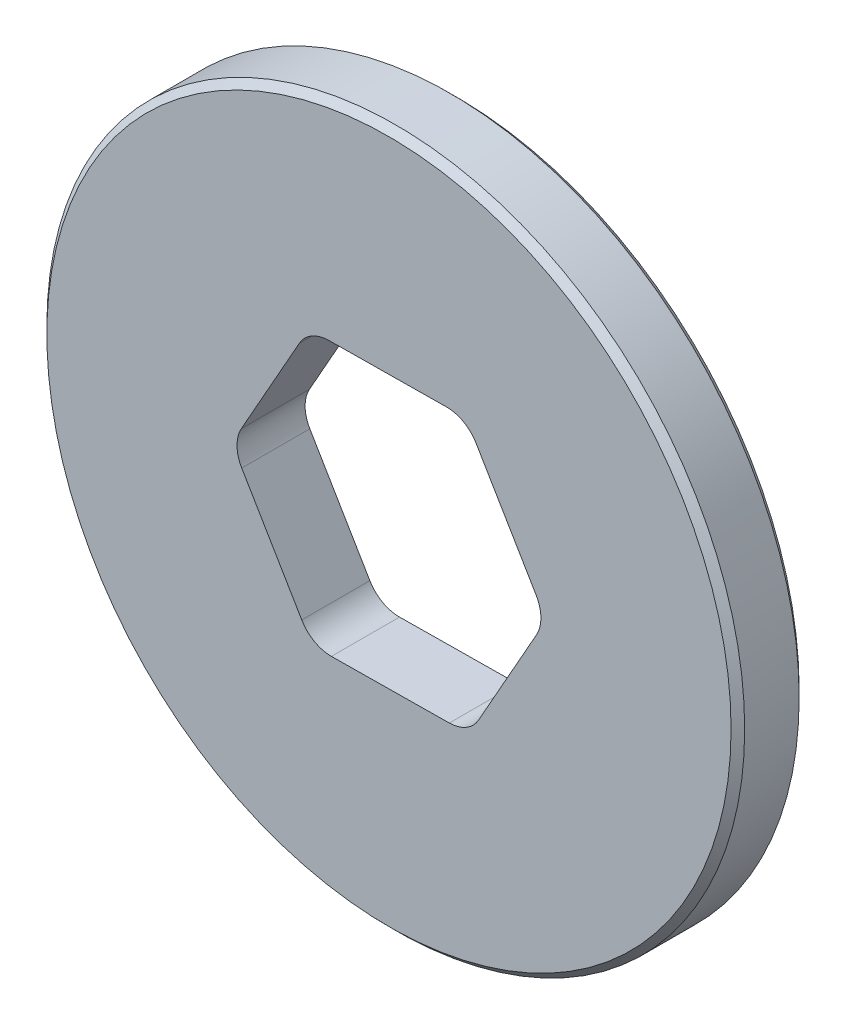
ISO-10303-21;
HEADER;
FILE_DESCRIPTION(('STEP AP214'),'2;1');
FILE_NAME('part.step','',(''),(''),'','','');
FILE_SCHEMA(('AUTOMOTIVE_DESIGN { 1 0 10303 214 1 1 1 1 }'));
ENDSEC;
DATA;
#1=APPLICATION_CONTEXT('core data for automotive mechanical design processes');
#2=APPLICATION_PROTOCOL_DEFINITION('international standard','automotive_design',2000,#1);
#3=PRODUCT_CONTEXT('',#1,'mechanical');
#4=PRODUCT('Part','Part','',(#3));
#5=PRODUCT_RELATED_PRODUCT_CATEGORY('part','',(#4));
#6=PRODUCT_DEFINITION_FORMATION('','',#4);
#7=PRODUCT_DEFINITION_CONTEXT('part definition',#1,'design');
#8=PRODUCT_DEFINITION('design','',#6,#7);
#9=PRODUCT_DEFINITION_SHAPE('','',#8);
#10=(LENGTH_UNIT() NAMED_UNIT(*) SI_UNIT(.MILLI.,.METRE.));
#11=(NAMED_UNIT(*) PLANE_ANGLE_UNIT() SI_UNIT($,.RADIAN.));
#12=(NAMED_UNIT(*) SI_UNIT($,.STERADIAN.) SOLID_ANGLE_UNIT());
#13=UNCERTAINTY_MEASURE_WITH_UNIT(LENGTH_MEASURE(1.E-05),#10,'distance_accuracy_value','');
#14=(GEOMETRIC_REPRESENTATION_CONTEXT(3) GLOBAL_UNCERTAINTY_ASSIGNED_CONTEXT((#13)) GLOBAL_UNIT_ASSIGNED_CONTEXT((#10,
#11,#12)) REPRESENTATION_CONTEXT('',''));
#15=CARTESIAN_POINT('',(0.,0.,0.));
#16=DIRECTION('',(0.,0.,1.));
#17=DIRECTION('',(1.,0.,0.));
#18=AXIS2_PLACEMENT_3D('',#15,#16,#17);
#19=CARTESIAN_POINT('',(0.,0.,20.));
#20=DIRECTION('',(0.,0.,1.));
#21=DIRECTION('',(1.,0.,0.));
#22=AXIS2_PLACEMENT_3D('',#19,#20,#21);
#23=PLANE('',#22);
#24=CARTESIAN_POINT('',(0.,0.,20.));
#25=DIRECTION('',(0.,0.,1.));
#26=DIRECTION('',(1.,0.,0.));
#27=AXIS2_PLACEMENT_3D('',#24,#25,#26);
#28=CIRCLE('',#27,100.5);
#29=CARTESIAN_POINT('',(100.5,0.,20.));
#30=VERTEX_POINT('',#29);
#31=EDGE_CURVE('E11',#30,#30,#28,.T.);
#32=ORIENTED_EDGE('',*,*,#31,.T.);
#33=EDGE_LOOP('',(#32));
#34=FACE_BOUND('',#33,.T.);
#35=DIRECTION('',(0.490930276854335,0.871198865511042,0.));
#36=VECTOR('',#35,1.);
#37=CARTESIAN_POINT('',(23.5104055206342,-39.7566870549933,20.));
#38=LINE('',#37,#36);
#39=CARTESIAN_POINT('',(26.344792795586,-34.7268180597883,20.));
#40=VERTEX_POINT('',#39);
#41=CARTESIAN_POINT('',(43.3511164452973,-4.54760408855848,20.));
#42=VERTEX_POINT('',#41);
#43=EDGE_CURVE('E242',#40,#42,#38,.T.);
#44=ORIENTED_EDGE('',*,*,#43,.F.);
#45=CARTESIAN_POINT('',(17.6328041404756,-29.817515291245,20.));
#46=DIRECTION('',(0.,0.,1.));
#47=DIRECTION('',(1.,0.,0.));
#48=AXIS2_PLACEMENT_3D('',#45,#46,#47);
#49=CIRCLE('',#48,10.);
#50=CARTESIAN_POINT('',(17.737217555603,-39.8169701683241,20.));
#51=VERTEX_POINT('',#50);
#52=EDGE_CURVE('E148',#40,#51,#49,.F.);
#53=ORIENTED_EDGE('',*,*,#52,.T.);
#54=DIRECTION('',(0.999945487707912,0.0104413415127392,0.));
#55=VECTOR('',#54,1.);
#56=CARTESIAN_POINT('',(-22.675098199615,-40.2389519616397,20.));
#57=LINE('',#56,#55);
#58=CARTESIAN_POINT('',(-16.9019102345839,-40.1786688483089,20.));
#59=VERTEX_POINT('',#58);
#60=EDGE_CURVE('E249',#59,#51,#57,.T.);
#61=ORIENTED_EDGE('',*,*,#60,.F.);
#62=CARTESIAN_POINT('',(-17.0063236497113,-30.1792139712298,20.));
#63=DIRECTION('',(0.,0.,1.));
#64=DIRECTION('',(1.,0.,0.));
#65=AXIS2_PLACEMENT_3D('',#62,#63,#64);
#66=CIRCLE('',#65,10.);
#67=CARTESIAN_POINT('',(-25.6138988896943,-35.2693660797656,20.));
#68=VERTEX_POINT('',#67);
#69=EDGE_CURVE('E147',#59,#68,#66,.F.);
#70=ORIENTED_EDGE('',*,*,#69,.T.);
#71=DIRECTION('',(0.509015210853577,-0.860757523998303,0.));
#72=VECTOR('',#71,1.);
#73=CARTESIAN_POINT('',(-46.1855037202492,-0.482264906646469,20.));
#74=LINE('',#73,#72);
#75=CARTESIAN_POINT('',(-43.2467030301699,-5.45185078852063,20.));
#76=VERTEX_POINT('',#75);
#77=EDGE_CURVE('E162',#76,#68,#74,.T.);
#78=ORIENTED_EDGE('',*,*,#77,.F.);
#79=CARTESIAN_POINT('',(-34.6391277901869,-0.361698679984854,20.));
#80=DIRECTION('',(0.,0.,1.));
#81=DIRECTION('',(1.,0.,0.));
#82=AXIS2_PLACEMENT_3D('',#79,#80,#81);
#83=CIRCLE('',#82,10.);
#84=CARTESIAN_POINT('',(-43.3511164452973,4.5476040885585,20.));
#85=VERTEX_POINT('',#84);
#86=EDGE_CURVE('E61',#76,#85,#83,.F.);
#87=ORIENTED_EDGE('',*,*,#86,.T.);
#88=DIRECTION('',(-0.490930276854335,-0.871198865511042,0.));
#89=VECTOR('',#88,1.);
#90=CARTESIAN_POINT('',(-23.5104055206342,39.7566870549933,20.));
#91=LINE('',#90,#89);
#92=CARTESIAN_POINT('',(-26.344792795586,34.7268180597883,20.));
#93=VERTEX_POINT('',#92);
#94=EDGE_CURVE('E167',#93,#85,#91,.T.);
#95=ORIENTED_EDGE('',*,*,#94,.F.);
#96=CARTESIAN_POINT('',(-17.6328041404756,29.817515291245,20.));
#97=DIRECTION('',(0.,0.,1.));
#98=DIRECTION('',(1.,0.,0.));
#99=AXIS2_PLACEMENT_3D('',#96,#97,#98);
#100=CIRCLE('',#99,10.);
#101=CARTESIAN_POINT('',(-17.737217555603,39.8169701683241,20.));
#102=VERTEX_POINT('',#101);
#103=EDGE_CURVE('E208',#93,#102,#100,.F.);
#104=ORIENTED_EDGE('',*,*,#103,.T.);
#105=DIRECTION('',(-0.999945487707912,-0.010441341512739,0.));
#106=VECTOR('',#105,1.);
#107=CARTESIAN_POINT('',(22.675098199615,40.2389519616397,20.));
#108=LINE('',#107,#106);
#109=CARTESIAN_POINT('',(16.9019102345839,40.1786688483089,20.));
#110=VERTEX_POINT('',#109);
#111=EDGE_CURVE('E270',#110,#102,#108,.T.);
#112=ORIENTED_EDGE('',*,*,#111,.F.);
#113=CARTESIAN_POINT('',(17.0063236497113,30.1792139712298,20.));
#114=DIRECTION('',(0.,0.,1.));
#115=DIRECTION('',(1.,0.,0.));
#116=AXIS2_PLACEMENT_3D('',#113,#114,#115);
#117=CIRCLE('',#116,10.);
#118=CARTESIAN_POINT('',(25.6138988896943,35.2693660797656,20.));
#119=VERTEX_POINT('',#118);
#120=EDGE_CURVE('E204',#110,#119,#117,.F.);
#121=ORIENTED_EDGE('',*,*,#120,.T.);
#122=DIRECTION('',(-0.509015210853577,0.860757523998303,0.));
#123=VECTOR('',#122,1.);
#124=CARTESIAN_POINT('',(46.1855037202492,0.482264906646483,20.));
#125=LINE('',#124,#123);
#126=CARTESIAN_POINT('',(43.2467030301699,5.45185078852064,20.));
#127=VERTEX_POINT('',#126);
#128=EDGE_CURVE('E248',#127,#119,#125,.T.);
#129=ORIENTED_EDGE('',*,*,#128,.F.);
#130=CARTESIAN_POINT('',(34.6391277901869,0.361698679984868,20.));
#131=DIRECTION('',(0.,0.,1.));
#132=DIRECTION('',(1.,0.,0.));
#133=AXIS2_PLACEMENT_3D('',#130,#131,#132);
#134=CIRCLE('',#133,10.);
#135=EDGE_CURVE('E200',#127,#42,#134,.F.);
#136=ORIENTED_EDGE('',*,*,#135,.T.);
#137=EDGE_LOOP('',(#44,#53,#61,#70,#78,#87,#95,#104,#112,#121,#129,#136));
#138=FACE_BOUND('',#137,.T.);
#139=ADVANCED_FACE('F45',(#34,#138),#23,.T.);
#140=CARTESIAN_POINT('',(0.,0.,0.));
#141=DIRECTION('',(0.,0.,1.));
#142=DIRECTION('',(1.,0.,0.));
#143=AXIS2_PLACEMENT_3D('',#140,#141,#142);
#144=PLANE('',#143);
#145=CARTESIAN_POINT('',(0.,0.,0.));
#146=DIRECTION('',(0.,0.,1.));
#147=DIRECTION('',(1.,0.,0.));
#148=AXIS2_PLACEMENT_3D('',#145,#146,#147);
#149=CIRCLE('',#148,100.5);
#150=CARTESIAN_POINT('',(100.5,0.,0.));
#151=VERTEX_POINT('',#150);
#152=EDGE_CURVE('E54',#151,#151,#149,.F.);
#153=ORIENTED_EDGE('',*,*,#152,.T.);
#154=EDGE_LOOP('',(#153));
#155=FACE_BOUND('',#154,.T.);
#156=DIRECTION('',(0.509015210853577,-0.860757523998303,0.));
#157=VECTOR('',#156,1.);
#158=CARTESIAN_POINT('',(-46.1855037202492,-0.482264906646469,0.));
#159=LINE('',#158,#157);
#160=CARTESIAN_POINT('',(-43.2467030301699,-5.45185078852063,0.));
#161=VERTEX_POINT('',#160);
#162=CARTESIAN_POINT('',(-25.6138988896943,-35.2693660797656,0.));
#163=VERTEX_POINT('',#162);
#164=EDGE_CURVE('E142',#161,#163,#159,.T.);
#165=ORIENTED_EDGE('',*,*,#164,.T.);
#166=CARTESIAN_POINT('',(-17.0063236497113,-30.1792139712298,0.));
#167=DIRECTION('',(0.,0.,1.));
#168=DIRECTION('',(1.,0.,0.));
#169=AXIS2_PLACEMENT_3D('',#166,#167,#168);
#170=CIRCLE('',#169,10.);
#171=CARTESIAN_POINT('',(-16.9019102345839,-40.1786688483089,0.));
#172=VERTEX_POINT('',#171);
#173=EDGE_CURVE('E137',#163,#172,#170,.T.);
#174=ORIENTED_EDGE('',*,*,#173,.T.);
#175=DIRECTION('',(0.999945487707912,0.0104413415127392,0.));
#176=VECTOR('',#175,1.);
#177=CARTESIAN_POINT('',(-22.675098199615,-40.2389519616397,0.));
#178=LINE('',#177,#176);
#179=CARTESIAN_POINT('',(17.737217555603,-39.8169701683241,0.));
#180=VERTEX_POINT('',#179);
#181=EDGE_CURVE('E140',#172,#180,#178,.T.);
#182=ORIENTED_EDGE('',*,*,#181,.T.);
#183=CARTESIAN_POINT('',(17.6328041404756,-29.817515291245,0.));
#184=DIRECTION('',(0.,0.,1.));
#185=DIRECTION('',(1.,0.,0.));
#186=AXIS2_PLACEMENT_3D('',#183,#184,#185);
#187=CIRCLE('',#186,10.);
#188=CARTESIAN_POINT('',(26.344792795586,-34.7268180597883,0.));
#189=VERTEX_POINT('',#188);
#190=EDGE_CURVE('E194',#180,#189,#187,.T.);
#191=ORIENTED_EDGE('',*,*,#190,.T.);
#192=DIRECTION('',(0.490930276854335,0.871198865511042,0.));
#193=VECTOR('',#192,1.);
#194=CARTESIAN_POINT('',(23.5104055206342,-39.7566870549933,0.));
#195=LINE('',#194,#193);
#196=CARTESIAN_POINT('',(43.3511164452973,-4.54760408855848,0.));
#197=VERTEX_POINT('',#196);
#198=EDGE_CURVE('E158',#189,#197,#195,.T.);
#199=ORIENTED_EDGE('',*,*,#198,.T.);
#200=CARTESIAN_POINT('',(34.6391277901869,0.361698679984868,0.));
#201=DIRECTION('',(0.,0.,1.));
#202=DIRECTION('',(1.,0.,0.));
#203=AXIS2_PLACEMENT_3D('',#200,#201,#202);
#204=CIRCLE('',#203,10.);
#205=CARTESIAN_POINT('',(43.2467030301699,5.45185078852064,0.));
#206=VERTEX_POINT('',#205);
#207=EDGE_CURVE('E198',#197,#206,#204,.T.);
#208=ORIENTED_EDGE('',*,*,#207,.T.);
#209=DIRECTION('',(-0.509015210853577,0.860757523998303,0.));
#210=VECTOR('',#209,1.);
#211=CARTESIAN_POINT('',(46.1855037202492,0.482264906646483,0.));
#212=LINE('',#211,#210);
#213=CARTESIAN_POINT('',(25.6138988896943,35.2693660797656,0.));
#214=VERTEX_POINT('',#213);
#215=EDGE_CURVE('E257',#206,#214,#212,.T.);
#216=ORIENTED_EDGE('',*,*,#215,.T.);
#217=CARTESIAN_POINT('',(17.0063236497113,30.1792139712298,0.));
#218=DIRECTION('',(0.,0.,1.));
#219=DIRECTION('',(1.,0.,0.));
#220=AXIS2_PLACEMENT_3D('',#217,#218,#219);
#221=CIRCLE('',#220,10.);
#222=CARTESIAN_POINT('',(16.9019102345839,40.1786688483089,0.));
#223=VERTEX_POINT('',#222);
#224=EDGE_CURVE('E202',#214,#223,#221,.T.);
#225=ORIENTED_EDGE('',*,*,#224,.T.);
#226=DIRECTION('',(-0.999945487707912,-0.010441341512739,0.));
#227=VECTOR('',#226,1.);
#228=CARTESIAN_POINT('',(22.675098199615,40.2389519616397,0.));
#229=LINE('',#228,#227);
#230=CARTESIAN_POINT('',(-17.737217555603,39.8169701683241,0.));
#231=VERTEX_POINT('',#230);
#232=EDGE_CURVE('E260',#223,#231,#229,.T.);
#233=ORIENTED_EDGE('',*,*,#232,.T.);
#234=CARTESIAN_POINT('',(-17.6328041404756,29.817515291245,0.));
#235=DIRECTION('',(0.,0.,1.));
#236=DIRECTION('',(1.,0.,0.));
#237=AXIS2_PLACEMENT_3D('',#234,#235,#236);
#238=CIRCLE('',#237,10.);
#239=CARTESIAN_POINT('',(-26.344792795586,34.7268180597883,0.));
#240=VERTEX_POINT('',#239);
#241=EDGE_CURVE('E206',#231,#240,#238,.T.);
#242=ORIENTED_EDGE('',*,*,#241,.T.);
#243=DIRECTION('',(-0.490930276854335,-0.871198865511042,0.));
#244=VECTOR('',#243,1.);
#245=CARTESIAN_POINT('',(-23.5104055206342,39.7566870549933,0.));
#246=LINE('',#245,#244);
#247=CARTESIAN_POINT('',(-43.3511164452973,4.5476040885585,0.));
#248=VERTEX_POINT('',#247);
#249=EDGE_CURVE('E264',#240,#248,#246,.T.);
#250=ORIENTED_EDGE('',*,*,#249,.T.);
#251=CARTESIAN_POINT('',(-34.6391277901869,-0.361698679984854,0.));
#252=DIRECTION('',(0.,0.,1.));
#253=DIRECTION('',(1.,0.,0.));
#254=AXIS2_PLACEMENT_3D('',#251,#252,#253);
#255=CIRCLE('',#254,10.);
#256=EDGE_CURVE('E210',#248,#161,#255,.T.);
#257=ORIENTED_EDGE('',*,*,#256,.T.);
#258=EDGE_LOOP('',(#165,#174,#182,#191,#199,#208,#216,#225,#233,#242,#250,#257));
#259=FACE_BOUND('',#258,.T.);
#260=ADVANCED_FACE('F139',(#155,#259),#144,.F.);
#261=CARTESIAN_POINT('',(0.,0.,20.));
#262=DIRECTION('',(0.,0.,-1.));
#263=DIRECTION('',(-1.,0.,0.));
#264=AXIS2_PLACEMENT_3D('',#261,#262,#263);
#265=CYLINDRICAL_SURFACE('',#264,102.5);
#266=CARTESIAN_POINT('',(0.,0.,2.00000000000003));
#267=DIRECTION('',(0.,0.,1.));
#268=DIRECTION('',(1.,0.,0.));
#269=AXIS2_PLACEMENT_3D('',#266,#267,#268);
#270=CIRCLE('',#269,102.5);
#271=CARTESIAN_POINT('',(102.5,0.,2.00000000000003));
#272=VERTEX_POINT('',#271);
#273=EDGE_CURVE('E216',#272,#272,#270,.T.);
#274=ORIENTED_EDGE('',*,*,#273,.T.);
#275=EDGE_LOOP('',(#274));
#276=FACE_BOUND('',#275,.T.);
#277=CARTESIAN_POINT('',(0.,0.,17.9999999999999));
#278=DIRECTION('',(0.,0.,1.));
#279=DIRECTION('',(1.,0.,0.));
#280=AXIS2_PLACEMENT_3D('',#277,#278,#279);
#281=CIRCLE('',#280,102.5);
#282=CARTESIAN_POINT('',(102.5,0.,17.9999999999999));
#283=VERTEX_POINT('',#282);
#284=EDGE_CURVE('E213',#283,#283,#281,.F.);
#285=ORIENTED_EDGE('',*,*,#284,.T.);
#286=EDGE_LOOP('',(#285));
#287=FACE_BOUND('',#286,.T.);
#288=ADVANCED_FACE('F228',(#276,#287),#265,.T.);
#289=CARTESIAN_POINT('',(-22.675098199615,-40.2389519616397,20.));
#290=DIRECTION('',(-0.0104413415127392,0.999945487707912,0.));
#291=DIRECTION('',(-0.999945487707912,-0.0104413415127392,0.));
#292=AXIS2_PLACEMENT_3D('',#289,#290,#291);
#293=PLANE('',#292);
#294=ORIENTED_EDGE('',*,*,#60,.T.);
#295=DIRECTION('',(0.,0.,-1.));
#296=VECTOR('',#295,1.);
#297=CARTESIAN_POINT('',(17.737217555603,-39.8169701683241,0.));
#298=LINE('',#297,#296);
#299=EDGE_CURVE('E157',#51,#180,#298,.T.);
#300=ORIENTED_EDGE('',*,*,#299,.T.);
#301=ORIENTED_EDGE('',*,*,#181,.F.);
#302=DIRECTION('',(0.,0.,-1.));
#303=VECTOR('',#302,1.);
#304=CARTESIAN_POINT('',(-16.9019102345839,-40.1786688483089,20.));
#305=LINE('',#304,#303);
#306=EDGE_CURVE('E154',#172,#59,#305,.F.);
#307=ORIENTED_EDGE('',*,*,#306,.T.);
#308=EDGE_LOOP('',(#294,#300,#301,#307));
#309=FACE_BOUND('',#308,.T.);
#310=ADVANCED_FACE('F153',(#309),#293,.T.);
#311=CARTESIAN_POINT('',(23.5104055206342,-39.7566870549933,20.));
#312=DIRECTION('',(-0.871198865511042,0.490930276854335,0.));
#313=DIRECTION('',(-0.490930276854335,-0.871198865511042,0.));
#314=AXIS2_PLACEMENT_3D('',#311,#312,#313);
#315=PLANE('',#314);
#316=ORIENTED_EDGE('',*,*,#198,.F.);
#317=DIRECTION('',(0.,0.,-1.));
#318=VECTOR('',#317,1.);
#319=CARTESIAN_POINT('',(26.344792795586,-34.7268180597883,20.));
#320=LINE('',#319,#318);
#321=EDGE_CURVE('E174',#189,#40,#320,.F.);
#322=ORIENTED_EDGE('',*,*,#321,.T.);
#323=ORIENTED_EDGE('',*,*,#43,.T.);
#324=DIRECTION('',(0.,0.,-1.));
#325=VECTOR('',#324,1.);
#326=CARTESIAN_POINT('',(43.3511164452973,-4.54760408855848,0.));
#327=LINE('',#326,#325);
#328=EDGE_CURVE('E164',#42,#197,#327,.T.);
#329=ORIENTED_EDGE('',*,*,#328,.T.);
#330=EDGE_LOOP('',(#316,#322,#323,#329));
#331=FACE_BOUND('',#330,.T.);
#332=ADVANCED_FACE('F256',(#331),#315,.T.);
#333=CARTESIAN_POINT('',(46.1855037202492,0.482264906646483,20.));
#334=DIRECTION('',(-0.860757523998303,-0.509015210853577,0.));
#335=DIRECTION('',(0.509015210853577,-0.860757523998303,0.));
#336=AXIS2_PLACEMENT_3D('',#333,#334,#335);
#337=PLANE('',#336);
#338=ORIENTED_EDGE('',*,*,#215,.F.);
#339=DIRECTION('',(0.,0.,-1.));
#340=VECTOR('',#339,1.);
#341=CARTESIAN_POINT('',(43.2467030301699,5.45185078852064,20.));
#342=LINE('',#341,#340);
#343=EDGE_CURVE('E183',#206,#127,#342,.F.);
#344=ORIENTED_EDGE('',*,*,#343,.T.);
#345=ORIENTED_EDGE('',*,*,#128,.T.);
#346=DIRECTION('',(0.,0.,-1.));
#347=VECTOR('',#346,1.);
#348=CARTESIAN_POINT('',(25.6138988896943,35.2693660797656,0.));
#349=LINE('',#348,#347);
#350=EDGE_CURVE('E180',#119,#214,#349,.T.);
#351=ORIENTED_EDGE('',*,*,#350,.T.);
#352=EDGE_LOOP('',(#338,#344,#345,#351));
#353=FACE_BOUND('',#352,.T.);
#354=ADVANCED_FACE('F292',(#353),#337,.T.);
#355=CARTESIAN_POINT('',(22.675098199615,40.2389519616397,20.));
#356=DIRECTION('',(0.010441341512739,-0.999945487707912,0.));
#357=DIRECTION('',(0.999945487707912,0.010441341512739,0.));
#358=AXIS2_PLACEMENT_3D('',#355,#356,#357);
#359=PLANE('',#358);
#360=ORIENTED_EDGE('',*,*,#232,.F.);
#361=DIRECTION('',(0.,0.,-1.));
#362=VECTOR('',#361,1.);
#363=CARTESIAN_POINT('',(16.9019102345839,40.1786688483089,20.));
#364=LINE('',#363,#362);
#365=EDGE_CURVE('E188',#223,#110,#364,.F.);
#366=ORIENTED_EDGE('',*,*,#365,.T.);
#367=ORIENTED_EDGE('',*,*,#111,.T.);
#368=DIRECTION('',(0.,0.,-1.));
#369=VECTOR('',#368,1.);
#370=CARTESIAN_POINT('',(-17.737217555603,39.8169701683241,0.));
#371=LINE('',#370,#369);
#372=EDGE_CURVE('E185',#102,#231,#371,.T.);
#373=ORIENTED_EDGE('',*,*,#372,.T.);
#374=EDGE_LOOP('',(#360,#366,#367,#373));
#375=FACE_BOUND('',#374,.T.);
#376=ADVANCED_FACE('F287',(#375),#359,.T.);
#377=CARTESIAN_POINT('',(-23.5104055206342,39.7566870549933,20.));
#378=DIRECTION('',(0.871198865511042,-0.490930276854335,0.));
#379=DIRECTION('',(0.490930276854335,0.871198865511042,0.));
#380=AXIS2_PLACEMENT_3D('',#377,#378,#379);
#381=PLANE('',#380);
#382=ORIENTED_EDGE('',*,*,#249,.F.);
#383=DIRECTION('',(0.,0.,-1.));
#384=VECTOR('',#383,1.);
#385=CARTESIAN_POINT('',(-26.344792795586,34.7268180597883,20.));
#386=LINE('',#385,#384);
#387=EDGE_CURVE('E68',#240,#93,#386,.F.);
#388=ORIENTED_EDGE('',*,*,#387,.T.);
#389=ORIENTED_EDGE('',*,*,#94,.T.);
#390=DIRECTION('',(0.,0.,-1.));
#391=VECTOR('',#390,1.);
#392=CARTESIAN_POINT('',(-43.3511164452973,4.54760408855849,0.));
#393=LINE('',#392,#391);
#394=EDGE_CURVE('E190',#85,#248,#393,.T.);
#395=ORIENTED_EDGE('',*,*,#394,.T.);
#396=EDGE_LOOP('',(#382,#388,#389,#395));
#397=FACE_BOUND('',#396,.T.);
#398=ADVANCED_FACE('F274',(#397),#381,.T.);
#399=CARTESIAN_POINT('',(-46.1855037202492,-0.482264906646469,20.));
#400=DIRECTION('',(0.860757523998303,0.509015210853577,0.));
#401=DIRECTION('',(-0.509015210853577,0.860757523998303,0.));
#402=AXIS2_PLACEMENT_3D('',#399,#400,#401);
#403=PLANE('',#402);
#404=ORIENTED_EDGE('',*,*,#77,.T.);
#405=DIRECTION('',(0.,0.,-1.));
#406=VECTOR('',#405,1.);
#407=CARTESIAN_POINT('',(-25.6138988896943,-35.2693660797656,0.));
#408=LINE('',#407,#406);
#409=EDGE_CURVE('E178',#68,#163,#408,.T.);
#410=ORIENTED_EDGE('',*,*,#409,.T.);
#411=ORIENTED_EDGE('',*,*,#164,.F.);
#412=DIRECTION('',(0.,0.,-1.));
#413=VECTOR('',#412,1.);
#414=CARTESIAN_POINT('',(-43.2467030301699,-5.45185078852063,20.));
#415=LINE('',#414,#413);
#416=EDGE_CURVE('E176',#161,#76,#415,.F.);
#417=ORIENTED_EDGE('',*,*,#416,.T.);
#418=EDGE_LOOP('',(#404,#410,#411,#417));
#419=FACE_BOUND('',#418,.T.);
#420=ADVANCED_FACE('F279',(#419),#403,.T.);
#421=CARTESIAN_POINT('',(17.6328041404756,-29.817515291245,20.));
#422=DIRECTION('',(0.,0.,1.));
#423=DIRECTION('',(1.,0.,0.));
#424=AXIS2_PLACEMENT_3D('',#421,#422,#423);
#425=CYLINDRICAL_SURFACE('',#424,10.);
#426=ORIENTED_EDGE('',*,*,#52,.F.);
#427=ORIENTED_EDGE('',*,*,#321,.F.);
#428=ORIENTED_EDGE('',*,*,#190,.F.);
#429=ORIENTED_EDGE('',*,*,#299,.F.);
#430=EDGE_LOOP('',(#426,#427,#428,#429));
#431=FACE_BOUND('',#430,.T.);
#432=ADVANCED_FACE('F253',(#431),#425,.F.);
#433=CARTESIAN_POINT('',(-17.0063236497113,-30.1792139712298,20.));
#434=DIRECTION('',(0.,0.,1.));
#435=DIRECTION('',(1.,0.,0.));
#436=AXIS2_PLACEMENT_3D('',#433,#434,#435);
#437=CYLINDRICAL_SURFACE('',#436,10.);
#438=ORIENTED_EDGE('',*,*,#69,.F.);
#439=ORIENTED_EDGE('',*,*,#306,.F.);
#440=ORIENTED_EDGE('',*,*,#173,.F.);
#441=ORIENTED_EDGE('',*,*,#409,.F.);
#442=EDGE_LOOP('',(#438,#439,#440,#441));
#443=FACE_BOUND('',#442,.T.);
#444=ADVANCED_FACE('F161',(#443),#437,.F.);
#445=CARTESIAN_POINT('',(34.6391277901869,0.361698679984868,20.));
#446=DIRECTION('',(0.,0.,1.));
#447=DIRECTION('',(1.,0.,0.));
#448=AXIS2_PLACEMENT_3D('',#445,#446,#447);
#449=CYLINDRICAL_SURFACE('',#448,10.);
#450=ORIENTED_EDGE('',*,*,#135,.F.);
#451=ORIENTED_EDGE('',*,*,#343,.F.);
#452=ORIENTED_EDGE('',*,*,#207,.F.);
#453=ORIENTED_EDGE('',*,*,#328,.F.);
#454=EDGE_LOOP('',(#450,#451,#452,#453));
#455=FACE_BOUND('',#454,.T.);
#456=ADVANCED_FACE('F305',(#455),#449,.F.);
#457=CARTESIAN_POINT('',(17.0063236497113,30.1792139712298,20.));
#458=DIRECTION('',(0.,0.,1.));
#459=DIRECTION('',(1.,0.,0.));
#460=AXIS2_PLACEMENT_3D('',#457,#458,#459);
#461=CYLINDRICAL_SURFACE('',#460,10.);
#462=ORIENTED_EDGE('',*,*,#120,.F.);
#463=ORIENTED_EDGE('',*,*,#365,.F.);
#464=ORIENTED_EDGE('',*,*,#224,.F.);
#465=ORIENTED_EDGE('',*,*,#350,.F.);
#466=EDGE_LOOP('',(#462,#463,#464,#465));
#467=FACE_BOUND('',#466,.T.);
#468=ADVANCED_FACE('F308',(#467),#461,.F.);
#469=CARTESIAN_POINT('',(-17.6328041404756,29.817515291245,20.));
#470=DIRECTION('',(0.,0.,1.));
#471=DIRECTION('',(1.,0.,0.));
#472=AXIS2_PLACEMENT_3D('',#469,#470,#471);
#473=CYLINDRICAL_SURFACE('',#472,10.);
#474=ORIENTED_EDGE('',*,*,#103,.F.);
#475=ORIENTED_EDGE('',*,*,#387,.F.);
#476=ORIENTED_EDGE('',*,*,#241,.F.);
#477=ORIENTED_EDGE('',*,*,#372,.F.);
#478=EDGE_LOOP('',(#474,#475,#476,#477));
#479=FACE_BOUND('',#478,.T.);
#480=ADVANCED_FACE('F312',(#479),#473,.F.);
#481=CARTESIAN_POINT('',(-34.6391277901869,-0.361698679984854,20.));
#482=DIRECTION('',(0.,0.,1.));
#483=DIRECTION('',(1.,0.,0.));
#484=AXIS2_PLACEMENT_3D('',#481,#482,#483);
#485=CYLINDRICAL_SURFACE('',#484,10.);
#486=ORIENTED_EDGE('',*,*,#86,.F.);
#487=ORIENTED_EDGE('',*,*,#416,.F.);
#488=ORIENTED_EDGE('',*,*,#256,.F.);
#489=ORIENTED_EDGE('',*,*,#394,.F.);
#490=EDGE_LOOP('',(#486,#487,#488,#489));
#491=FACE_BOUND('',#490,.T.);
#492=ADVANCED_FACE('F225',(#491),#485,.F.);
#493=CARTESIAN_POINT('',(0.,0.,2.00000000000003));
#494=DIRECTION('',(0.,0.,1.));
#495=DIRECTION('',(1.,0.,0.));
#496=AXIS2_PLACEMENT_3D('',#493,#494,#495);
#497=CONICAL_SURFACE('',#496,102.5,0.785398163397448);
#498=ORIENTED_EDGE('',*,*,#152,.F.);
#499=EDGE_LOOP('',(#498));
#500=FACE_BOUND('',#499,.T.);
#501=ORIENTED_EDGE('',*,*,#273,.F.);
#502=EDGE_LOOP('',(#501));
#503=FACE_BOUND('',#502,.T.);
#504=ADVANCED_FACE('F222',(#500,#503),#497,.T.);
#505=CARTESIAN_POINT('',(0.,0.,20.));
#506=DIRECTION('',(0.,0.,-1.));
#507=DIRECTION('',(-1.,0.,0.));
#508=AXIS2_PLACEMENT_3D('',#505,#506,#507);
#509=CONICAL_SURFACE('',#508,100.5,0.785398163397441);
#510=ORIENTED_EDGE('',*,*,#284,.F.);
#511=EDGE_LOOP('',(#510));
#512=FACE_BOUND('',#511,.T.);
#513=ORIENTED_EDGE('',*,*,#31,.F.);
#514=EDGE_LOOP('',(#513));
#515=FACE_BOUND('',#514,.T.);
#516=ADVANCED_FACE('F48',(#512,#515),#509,.T.);
#517=CLOSED_SHELL('',(#139,#260,#288,#310,#332,#354,#376,#398,#420,#432,#444,#456,#468,#480,
#492,#504,#516));
#518=MANIFOLD_SOLID_BREP('B2',#517);
#519=ADVANCED_BREP_SHAPE_REPRESENTATION('',(#18,#518),#14);
#520=SHAPE_DEFINITION_REPRESENTATION(#9,#519);
ENDSEC;
END-ISO-10303-21;
